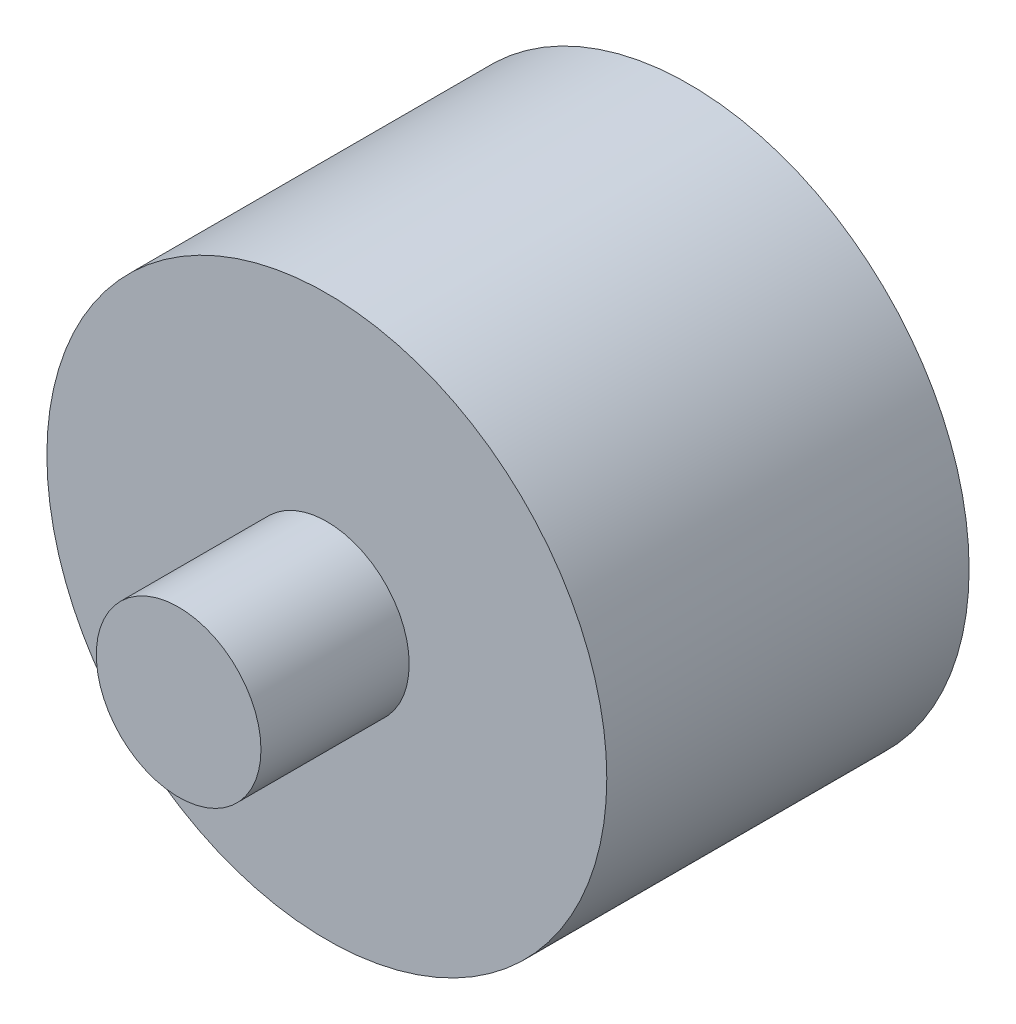
ISO-10303-21;
HEADER;
FILE_DESCRIPTION(('STEP AP214'),'2;1');
FILE_NAME('part.step','',(''),(''),'','','');
FILE_SCHEMA(('AUTOMOTIVE_DESIGN { 1 0 10303 214 1 1 1 1 }'));
ENDSEC;
DATA;
#1=APPLICATION_CONTEXT('core data for automotive mechanical design processes');
#2=APPLICATION_PROTOCOL_DEFINITION('international standard','automotive_design',2000,#1);
#3=PRODUCT_CONTEXT('',#1,'mechanical');
#4=PRODUCT('Part','Part','',(#3));
#5=PRODUCT_RELATED_PRODUCT_CATEGORY('part','',(#4));
#6=PRODUCT_DEFINITION_FORMATION('','',#4);
#7=PRODUCT_DEFINITION_CONTEXT('part definition',#1,'design');
#8=PRODUCT_DEFINITION('design','',#6,#7);
#9=PRODUCT_DEFINITION_SHAPE('','',#8);
#10=(LENGTH_UNIT() NAMED_UNIT(*) SI_UNIT(.MILLI.,.METRE.));
#11=(NAMED_UNIT(*) PLANE_ANGLE_UNIT() SI_UNIT($,.RADIAN.));
#12=(NAMED_UNIT(*) SI_UNIT($,.STERADIAN.) SOLID_ANGLE_UNIT());
#13=UNCERTAINTY_MEASURE_WITH_UNIT(LENGTH_MEASURE(1.E-05),#10,'distance_accuracy_value','');
#14=(GEOMETRIC_REPRESENTATION_CONTEXT(3) GLOBAL_UNCERTAINTY_ASSIGNED_CONTEXT((#13)) GLOBAL_UNIT_ASSIGNED_CONTEXT((#10,
#11,#12)) REPRESENTATION_CONTEXT('',''));
#15=CARTESIAN_POINT('',(0.,0.,0.));
#16=DIRECTION('',(0.,0.,1.));
#17=DIRECTION('',(1.,0.,0.));
#18=AXIS2_PLACEMENT_3D('',#15,#16,#17);
#19=CARTESIAN_POINT('',(0.,0.,22.));
#20=DIRECTION('',(0.,0.,-1.));
#21=DIRECTION('',(-1.,0.,0.));
#22=AXIS2_PLACEMENT_3D('',#19,#20,#21);
#23=CYLINDRICAL_SURFACE('',#22,17.);
#24=CARTESIAN_POINT('',(0.,0.,22.));
#25=DIRECTION('',(0.,0.,1.));
#26=DIRECTION('',(1.,0.,0.));
#27=AXIS2_PLACEMENT_3D('',#24,#25,#26);
#28=CIRCLE('',#27,17.);
#29=CARTESIAN_POINT('',(17.,0.,22.));
#30=VERTEX_POINT('',#29);
#31=EDGE_CURVE('E10',#30,#30,#28,.T.);
#32=ORIENTED_EDGE('',*,*,#31,.F.);
#33=EDGE_LOOP('',(#32));
#34=FACE_BOUND('',#33,.T.);
#35=CARTESIAN_POINT('',(0.,0.,0.));
#36=DIRECTION('',(0.,0.,1.));
#37=DIRECTION('',(1.,0.,0.));
#38=AXIS2_PLACEMENT_3D('',#35,#36,#37);
#39=CIRCLE('',#38,17.);
#40=CARTESIAN_POINT('',(17.,0.,0.));
#41=VERTEX_POINT('',#40);
#42=EDGE_CURVE('E36',#41,#41,#39,.T.);
#43=ORIENTED_EDGE('',*,*,#42,.T.);
#44=EDGE_LOOP('',(#43));
#45=FACE_BOUND('',#44,.T.);
#46=ADVANCED_FACE('F33',(#34,#45),#23,.T.);
#47=CARTESIAN_POINT('',(0.,0.,22.));
#48=DIRECTION('',(0.,0.,1.));
#49=DIRECTION('',(1.,0.,0.));
#50=AXIS2_PLACEMENT_3D('',#47,#48,#49);
#51=PLANE('',#50);
#52=CARTESIAN_POINT('',(0.,0.,22.));
#53=DIRECTION('',(0.,0.,1.));
#54=DIRECTION('',(1.,0.,0.));
#55=AXIS2_PLACEMENT_3D('',#52,#53,#54);
#56=CIRCLE('',#55,5.);
#57=CARTESIAN_POINT('',(5.,0.,22.));
#58=VERTEX_POINT('',#57);
#59=EDGE_CURVE('E43',#58,#58,#56,.F.);
#60=ORIENTED_EDGE('',*,*,#59,.T.);
#61=EDGE_LOOP('',(#60));
#62=FACE_BOUND('',#61,.T.);
#63=ORIENTED_EDGE('',*,*,#31,.T.);
#64=EDGE_LOOP('',(#63));
#65=FACE_BOUND('',#64,.T.);
#66=ADVANCED_FACE('F63',(#62,#65),#51,.T.);
#67=CARTESIAN_POINT('',(0.,0.,0.));
#68=DIRECTION('',(0.,0.,1.));
#69=DIRECTION('',(1.,0.,0.));
#70=AXIS2_PLACEMENT_3D('',#67,#68,#69);
#71=PLANE('',#70);
#72=ORIENTED_EDGE('',*,*,#42,.F.);
#73=EDGE_LOOP('',(#72));
#74=FACE_BOUND('',#73,.T.);
#75=ADVANCED_FACE('F55',(#74),#71,.F.);
#76=CARTESIAN_POINT('',(0.,0.,31.));
#77=DIRECTION('',(0.,0.,-1.));
#78=DIRECTION('',(-1.,0.,0.));
#79=AXIS2_PLACEMENT_3D('',#76,#77,#78);
#80=CYLINDRICAL_SURFACE('',#79,5.);
#81=ORIENTED_EDGE('',*,*,#59,.F.);
#82=EDGE_LOOP('',(#81));
#83=FACE_BOUND('',#82,.T.);
#84=CARTESIAN_POINT('',(0.,0.,31.));
#85=DIRECTION('',(0.,0.,1.));
#86=DIRECTION('',(1.,0.,0.));
#87=AXIS2_PLACEMENT_3D('',#84,#85,#86);
#88=CIRCLE('',#87,5.);
#89=CARTESIAN_POINT('',(5.,0.,31.));
#90=VERTEX_POINT('',#89);
#91=EDGE_CURVE('E47',#90,#90,#88,.T.);
#92=ORIENTED_EDGE('',*,*,#91,.F.);
#93=EDGE_LOOP('',(#92));
#94=FACE_BOUND('',#93,.T.);
#95=ADVANCED_FACE('F53',(#83,#94),#80,.T.);
#96=CARTESIAN_POINT('',(0.,0.,31.));
#97=DIRECTION('',(0.,0.,1.));
#98=DIRECTION('',(1.,0.,0.));
#99=AXIS2_PLACEMENT_3D('',#96,#97,#98);
#100=PLANE('',#99);
#101=ORIENTED_EDGE('',*,*,#91,.T.);
#102=EDGE_LOOP('',(#101));
#103=FACE_BOUND('',#102,.T.);
#104=ADVANCED_FACE('F51',(#103),#100,.T.);
#105=CLOSED_SHELL('',(#46,#66,#75,#95,#104));
#106=MANIFOLD_SOLID_BREP('B2',#105);
#107=ADVANCED_BREP_SHAPE_REPRESENTATION('',(#18,#106),#14);
#108=SHAPE_DEFINITION_REPRESENTATION(#9,#107);
ENDSEC;
END-ISO-10303-21;
